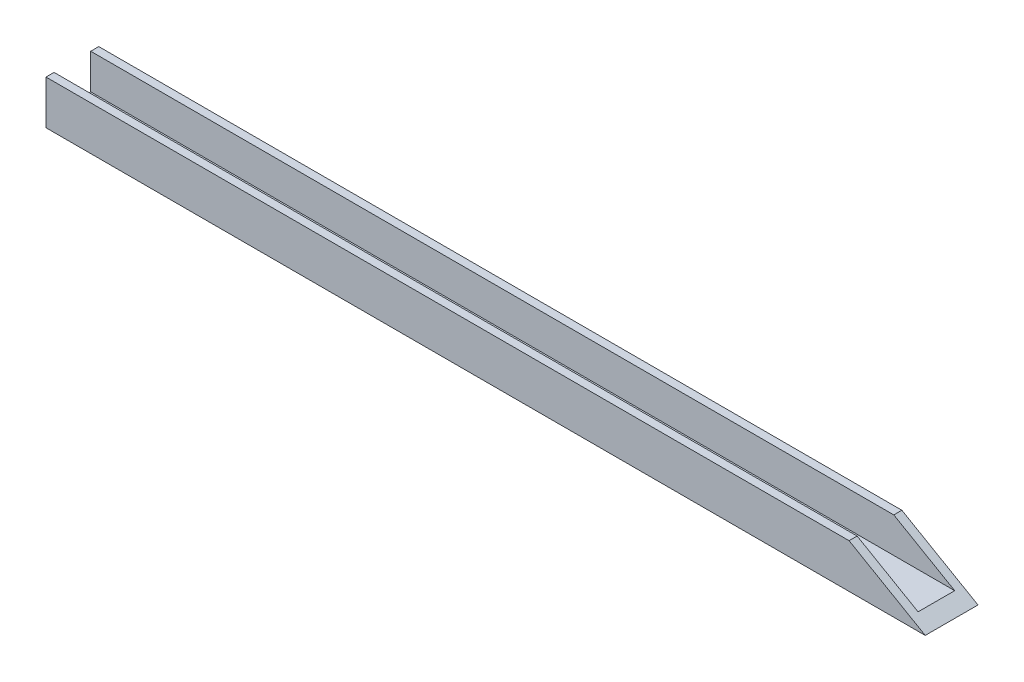
ISO-10303-21;
HEADER;
FILE_DESCRIPTION(('STEP AP214'),'2;1');
FILE_NAME('part.step','',(''),(''),'','','');
FILE_SCHEMA(('AUTOMOTIVE_DESIGN { 1 0 10303 214 1 1 1 1 }'));
ENDSEC;
DATA;
#1=APPLICATION_CONTEXT('core data for automotive mechanical design processes');
#2=APPLICATION_PROTOCOL_DEFINITION('international standard','automotive_design',2000,#1);
#3=PRODUCT_CONTEXT('',#1,'mechanical');
#4=PRODUCT('Part','Part','',(#3));
#5=PRODUCT_RELATED_PRODUCT_CATEGORY('part','',(#4));
#6=PRODUCT_DEFINITION_FORMATION('','',#4);
#7=PRODUCT_DEFINITION_CONTEXT('part definition',#1,'design');
#8=PRODUCT_DEFINITION('design','',#6,#7);
#9=PRODUCT_DEFINITION_SHAPE('','',#8);
#10=(LENGTH_UNIT() NAMED_UNIT(*) SI_UNIT(.MILLI.,.METRE.));
#11=(NAMED_UNIT(*) PLANE_ANGLE_UNIT() SI_UNIT($,.RADIAN.));
#12=(NAMED_UNIT(*) SI_UNIT($,.STERADIAN.) SOLID_ANGLE_UNIT());
#13=UNCERTAINTY_MEASURE_WITH_UNIT(LENGTH_MEASURE(1.E-05),#10,'distance_accuracy_value','');
#14=(GEOMETRIC_REPRESENTATION_CONTEXT(3) GLOBAL_UNCERTAINTY_ASSIGNED_CONTEXT((#13)) GLOBAL_UNIT_ASSIGNED_CONTEXT((#10,
#11,#12)) REPRESENTATION_CONTEXT('',''));
#15=CARTESIAN_POINT('',(0.,0.,0.));
#16=DIRECTION('',(0.,0.,1.));
#17=DIRECTION('',(1.,0.,0.));
#18=AXIS2_PLACEMENT_3D('',#15,#16,#17);
#19=CARTESIAN_POINT('',(0.,5.,0.));
#20=DIRECTION('',(0.,1.,0.));
#21=DIRECTION('',(0.,0.,1.));
#22=AXIS2_PLACEMENT_3D('',#19,#20,#21);
#23=PLANE('',#22);
#24=DIRECTION('',(0.,0.,1.));
#25=VECTOR('',#24,1.);
#26=CARTESIAN_POINT('',(41.3397459621556,5.,-17.));
#27=LINE('',#26,#25);
#28=CARTESIAN_POINT('',(41.3397459621556,5.,2.08375));
#29=VERTEX_POINT('',#28);
#30=CARTESIAN_POINT('',(41.3397459621556,5.,3.));
#31=VERTEX_POINT('',#30);
#32=EDGE_CURVE('E162',#29,#31,#27,.T.);
#33=ORIENTED_EDGE('',*,*,#32,.F.);
#34=DIRECTION('',(1.,0.,0.));
#35=VECTOR('',#34,1.);
#36=CARTESIAN_POINT('',(-50.,5.,2.08375));
#37=LINE('',#36,#35);
#38=CARTESIAN_POINT('',(-50.,5.,2.08375));
#39=VERTEX_POINT('',#38);
#40=EDGE_CURVE('E153',#39,#29,#37,.T.);
#41=ORIENTED_EDGE('',*,*,#40,.F.);
#42=DIRECTION('',(0.,0.,1.));
#43=VECTOR('',#42,1.);
#44=CARTESIAN_POINT('',(-50.,5.,-3.));
#45=LINE('',#44,#43);
#46=CARTESIAN_POINT('',(-50.,5.,3.));
#47=VERTEX_POINT('',#46);
#48=EDGE_CURVE('E63',#39,#47,#45,.T.);
#49=ORIENTED_EDGE('',*,*,#48,.T.);
#50=DIRECTION('',(1.,0.,0.));
#51=VECTOR('',#50,1.);
#52=CARTESIAN_POINT('',(-50.,5.,3.));
#53=LINE('',#52,#51);
#54=EDGE_CURVE('E97',#47,#31,#53,.T.);
#55=ORIENTED_EDGE('',*,*,#54,.T.);
#56=EDGE_LOOP('',(#33,#41,#49,#55));
#57=FACE_BOUND('',#56,.T.);
#58=ADVANCED_FACE('F39',(#57),#23,.T.);
#59=CARTESIAN_POINT('',(-50.,5.,-3.));
#60=DIRECTION('',(0.,0.,1.));
#61=DIRECTION('',(1.,0.,0.));
#62=AXIS2_PLACEMENT_3D('',#59,#60,#61);
#63=PLANE('',#62);
#64=DIRECTION('',(-1.,0.,0.));
#65=VECTOR('',#64,1.);
#66=CARTESIAN_POINT('',(-50.,5.,-3.));
#67=LINE('',#66,#65);
#68=CARTESIAN_POINT('',(41.3397459621556,5.,-3.));
#69=VERTEX_POINT('',#68);
#70=CARTESIAN_POINT('',(-50.,5.,-3.));
#71=VERTEX_POINT('',#70);
#72=EDGE_CURVE('E104',#69,#71,#67,.T.);
#73=ORIENTED_EDGE('',*,*,#72,.F.);
#74=DIRECTION('',(0.866025403784439,-0.5,0.));
#75=VECTOR('',#74,1.);
#76=CARTESIAN_POINT('',(-27.1650635094611,44.5512701892219,-3.));
#77=LINE('',#76,#75);
#78=CARTESIAN_POINT('',(50.,0.,-3.));
#79=VERTEX_POINT('',#78);
#80=EDGE_CURVE('E127',#69,#79,#77,.T.);
#81=ORIENTED_EDGE('',*,*,#80,.T.);
#82=DIRECTION('',(-1.,0.,0.));
#83=VECTOR('',#82,1.);
#84=CARTESIAN_POINT('',(-50.,0.,-3.));
#85=LINE('',#84,#83);
#86=CARTESIAN_POINT('',(-50.,0.,-3.));
#87=VERTEX_POINT('',#86);
#88=EDGE_CURVE('E89',#79,#87,#85,.T.);
#89=ORIENTED_EDGE('',*,*,#88,.T.);
#90=DIRECTION('',(0.,-1.,0.));
#91=VECTOR('',#90,1.);
#92=CARTESIAN_POINT('',(-50.,5.,-3.));
#93=LINE('',#92,#91);
#94=EDGE_CURVE('E48',#71,#87,#93,.T.);
#95=ORIENTED_EDGE('',*,*,#94,.F.);
#96=EDGE_LOOP('',(#73,#81,#89,#95));
#97=FACE_BOUND('',#96,.T.);
#98=ADVANCED_FACE('F41',(#97),#63,.F.);
#99=CARTESIAN_POINT('',(-50.,5.,-3.));
#100=DIRECTION('',(1.,0.,0.));
#101=DIRECTION('',(0.,0.,-1.));
#102=AXIS2_PLACEMENT_3D('',#99,#100,#101);
#103=PLANE('',#102);
#104=ORIENTED_EDGE('',*,*,#48,.F.);
#105=DIRECTION('',(0.,1.,0.));
#106=VECTOR('',#105,1.);
#107=CARTESIAN_POINT('',(-50.,1.,2.08375));
#108=LINE('',#107,#106);
#109=CARTESIAN_POINT('',(-50.,1.,2.08375));
#110=VERTEX_POINT('',#109);
#111=EDGE_CURVE('E120',#110,#39,#108,.T.);
#112=ORIENTED_EDGE('',*,*,#111,.F.);
#113=DIRECTION('',(0.,0.,1.));
#114=VECTOR('',#113,1.);
#115=CARTESIAN_POINT('',(-50.,1.,-2.08375));
#116=LINE('',#115,#114);
#117=CARTESIAN_POINT('',(-50.,1.,-2.08375));
#118=VERTEX_POINT('',#117);
#119=EDGE_CURVE('E169',#118,#110,#116,.T.);
#120=ORIENTED_EDGE('',*,*,#119,.F.);
#121=DIRECTION('',(0.,1.,0.));
#122=VECTOR('',#121,1.);
#123=CARTESIAN_POINT('',(-50.,1.,-2.08375));
#124=LINE('',#123,#122);
#125=CARTESIAN_POINT('',(-50.,5.,-2.08375));
#126=VERTEX_POINT('',#125);
#127=EDGE_CURVE('E158',#118,#126,#124,.T.);
#128=ORIENTED_EDGE('',*,*,#127,.T.);
#129=EDGE_CURVE('E112',#71,#126,#45,.T.);
#130=ORIENTED_EDGE('',*,*,#129,.F.);
#131=ORIENTED_EDGE('',*,*,#94,.T.);
#132=DIRECTION('',(0.,0.,1.));
#133=VECTOR('',#132,1.);
#134=CARTESIAN_POINT('',(-50.,0.,-3.));
#135=LINE('',#134,#133);
#136=CARTESIAN_POINT('',(-50.,0.,3.));
#137=VERTEX_POINT('',#136);
#138=EDGE_CURVE('E77',#87,#137,#135,.T.);
#139=ORIENTED_EDGE('',*,*,#138,.T.);
#140=DIRECTION('',(0.,-1.,0.));
#141=VECTOR('',#140,1.);
#142=CARTESIAN_POINT('',(-50.,5.,3.));
#143=LINE('',#142,#141);
#144=EDGE_CURVE('E80',#47,#137,#143,.T.);
#145=ORIENTED_EDGE('',*,*,#144,.F.);
#146=EDGE_LOOP('',(#104,#112,#120,#128,#130,#131,#139,#145));
#147=FACE_BOUND('',#146,.T.);
#148=ADVANCED_FACE('F79',(#147),#103,.F.);
#149=CARTESIAN_POINT('',(-50.,5.,3.));
#150=DIRECTION('',(0.,0.,-1.));
#151=DIRECTION('',(-1.,0.,0.));
#152=AXIS2_PLACEMENT_3D('',#149,#150,#151);
#153=PLANE('',#152);
#154=DIRECTION('',(1.,0.,0.));
#155=VECTOR('',#154,1.);
#156=CARTESIAN_POINT('',(-50.,0.,3.));
#157=LINE('',#156,#155);
#158=CARTESIAN_POINT('',(50.,0.,3.));
#159=VERTEX_POINT('',#158);
#160=EDGE_CURVE('E88',#137,#159,#157,.T.);
#161=ORIENTED_EDGE('',*,*,#160,.T.);
#162=DIRECTION('',(0.866025403784439,-0.5,0.));
#163=VECTOR('',#162,1.);
#164=CARTESIAN_POINT('',(50.,0.,3.));
#165=LINE('',#164,#163);
#166=EDGE_CURVE('E191',#31,#159,#165,.T.);
#167=ORIENTED_EDGE('',*,*,#166,.F.);
#168=ORIENTED_EDGE('',*,*,#54,.F.);
#169=ORIENTED_EDGE('',*,*,#144,.T.);
#170=EDGE_LOOP('',(#161,#167,#168,#169));
#171=FACE_BOUND('',#170,.T.);
#172=ADVANCED_FACE('F93',(#171),#153,.F.);
#173=CARTESIAN_POINT('',(41.3397459621556,5.,-2.08375));
#174=VERTEX_POINT('',#173);
#175=EDGE_CURVE('E188',#69,#174,#27,.T.);
#176=ORIENTED_EDGE('',*,*,#175,.F.);
#177=ORIENTED_EDGE('',*,*,#72,.T.);
#178=ORIENTED_EDGE('',*,*,#129,.T.);
#179=DIRECTION('',(-1.,0.,0.));
#180=VECTOR('',#179,1.);
#181=CARTESIAN_POINT('',(-50.,5.,-2.08375));
#182=LINE('',#181,#180);
#183=EDGE_CURVE('E165',#174,#126,#182,.T.);
#184=ORIENTED_EDGE('',*,*,#183,.F.);
#185=EDGE_LOOP('',(#176,#177,#178,#184));
#186=FACE_BOUND('',#185,.T.);
#187=ADVANCED_FACE('F206',(#186),#23,.T.);
#188=CARTESIAN_POINT('',(0.,0.,0.));
#189=DIRECTION('',(0.,1.,0.));
#190=DIRECTION('',(0.,0.,1.));
#191=AXIS2_PLACEMENT_3D('',#188,#189,#190);
#192=PLANE('',#191);
#193=DIRECTION('',(0.,0.,-1.));
#194=VECTOR('',#193,1.);
#195=CARTESIAN_POINT('',(50.,0.,-3.));
#196=LINE('',#195,#194);
#197=EDGE_CURVE('E102',#159,#79,#196,.T.);
#198=ORIENTED_EDGE('',*,*,#197,.F.);
#199=ORIENTED_EDGE('',*,*,#160,.F.);
#200=ORIENTED_EDGE('',*,*,#138,.F.);
#201=ORIENTED_EDGE('',*,*,#88,.F.);
#202=EDGE_LOOP('',(#198,#199,#200,#201));
#203=FACE_BOUND('',#202,.T.);
#204=ADVANCED_FACE('F100',(#203),#192,.F.);
#205=CARTESIAN_POINT('',(-50.,1.,2.08375));
#206=DIRECTION('',(0.,0.,1.));
#207=DIRECTION('',(1.,0.,0.));
#208=AXIS2_PLACEMENT_3D('',#205,#206,#207);
#209=PLANE('',#208);
#210=ORIENTED_EDGE('',*,*,#40,.T.);
#211=DIRECTION('',(0.866025403784439,-0.5,0.));
#212=VECTOR('',#211,1.);
#213=CARTESIAN_POINT('',(-25.4330127018922,43.5512701892219,2.08375));
#214=LINE('',#213,#212);
#215=CARTESIAN_POINT('',(48.2679491924311,1.,2.08375));
#216=VERTEX_POINT('',#215);
#217=EDGE_CURVE('E183',#29,#216,#214,.T.);
#218=ORIENTED_EDGE('',*,*,#217,.T.);
#219=DIRECTION('',(1.,0.,0.));
#220=VECTOR('',#219,1.);
#221=CARTESIAN_POINT('',(-50.,1.,2.08375));
#222=LINE('',#221,#220);
#223=EDGE_CURVE('E155',#110,#216,#222,.T.);
#224=ORIENTED_EDGE('',*,*,#223,.F.);
#225=ORIENTED_EDGE('',*,*,#111,.T.);
#226=EDGE_LOOP('',(#210,#218,#224,#225));
#227=FACE_BOUND('',#226,.T.);
#228=ADVANCED_FACE('F151',(#227),#209,.F.);
#229=CARTESIAN_POINT('',(-50.,1.,-2.08375));
#230=DIRECTION('',(0.,0.,-1.));
#231=DIRECTION('',(-1.,0.,0.));
#232=AXIS2_PLACEMENT_3D('',#229,#230,#231);
#233=PLANE('',#232);
#234=DIRECTION('',(-1.,0.,0.));
#235=VECTOR('',#234,1.);
#236=CARTESIAN_POINT('',(-50.,1.,-2.08375));
#237=LINE('',#236,#235);
#238=CARTESIAN_POINT('',(48.2679491924311,1.,-2.08375));
#239=VERTEX_POINT('',#238);
#240=EDGE_CURVE('E164',#239,#118,#237,.T.);
#241=ORIENTED_EDGE('',*,*,#240,.F.);
#242=DIRECTION('',(-0.866025403784439,0.5,0.));
#243=VECTOR('',#242,1.);
#244=CARTESIAN_POINT('',(-25.4330127018922,43.5512701892219,-2.08375));
#245=LINE('',#244,#243);
#246=EDGE_CURVE('E54',#239,#174,#245,.T.);
#247=ORIENTED_EDGE('',*,*,#246,.T.);
#248=ORIENTED_EDGE('',*,*,#183,.T.);
#249=ORIENTED_EDGE('',*,*,#127,.F.);
#250=EDGE_LOOP('',(#241,#247,#248,#249));
#251=FACE_BOUND('',#250,.T.);
#252=ADVANCED_FACE('F205',(#251),#233,.F.);
#253=CARTESIAN_POINT('',(0.,1.,0.));
#254=DIRECTION('',(0.,1.,0.));
#255=DIRECTION('',(0.,0.,1.));
#256=AXIS2_PLACEMENT_3D('',#253,#254,#255);
#257=PLANE('',#256);
#258=DIRECTION('',(0.,0.,1.));
#259=VECTOR('',#258,1.);
#260=CARTESIAN_POINT('',(48.2679491924311,1.,0.));
#261=LINE('',#260,#259);
#262=EDGE_CURVE('E11',#239,#216,#261,.T.);
#263=ORIENTED_EDGE('',*,*,#262,.F.);
#264=ORIENTED_EDGE('',*,*,#240,.T.);
#265=ORIENTED_EDGE('',*,*,#119,.T.);
#266=ORIENTED_EDGE('',*,*,#223,.T.);
#267=EDGE_LOOP('',(#263,#264,#265,#266));
#268=FACE_BOUND('',#267,.T.);
#269=ADVANCED_FACE('F259',(#268),#257,.T.);
#270=CARTESIAN_POINT('',(50.,0.,-17.));
#271=DIRECTION('',(-0.5,-0.866025403784439,0.));
#272=DIRECTION('',(0.866025403784439,-0.5,0.));
#273=AXIS2_PLACEMENT_3D('',#270,#271,#272);
#274=PLANE('',#273);
#275=ORIENTED_EDGE('',*,*,#175,.T.);
#276=ORIENTED_EDGE('',*,*,#246,.F.);
#277=ORIENTED_EDGE('',*,*,#262,.T.);
#278=ORIENTED_EDGE('',*,*,#217,.F.);
#279=ORIENTED_EDGE('',*,*,#32,.T.);
#280=ORIENTED_EDGE('',*,*,#166,.T.);
#281=ORIENTED_EDGE('',*,*,#197,.T.);
#282=ORIENTED_EDGE('',*,*,#80,.F.);
#283=EDGE_LOOP('',(#275,#276,#277,#278,#279,#280,#281,#282));
#284=FACE_BOUND('',#283,.T.);
#285=ADVANCED_FACE('F193',(#284),#274,.F.);
#286=CLOSED_SHELL('',(#58,#98,#148,#172,#187,#204,#228,#252,#269,#285));
#287=MANIFOLD_SOLID_BREP('B2',#286);
#288=ADVANCED_BREP_SHAPE_REPRESENTATION('',(#18,#287),#14);
#289=SHAPE_DEFINITION_REPRESENTATION(#9,#288);
ENDSEC;
END-ISO-10303-21;
